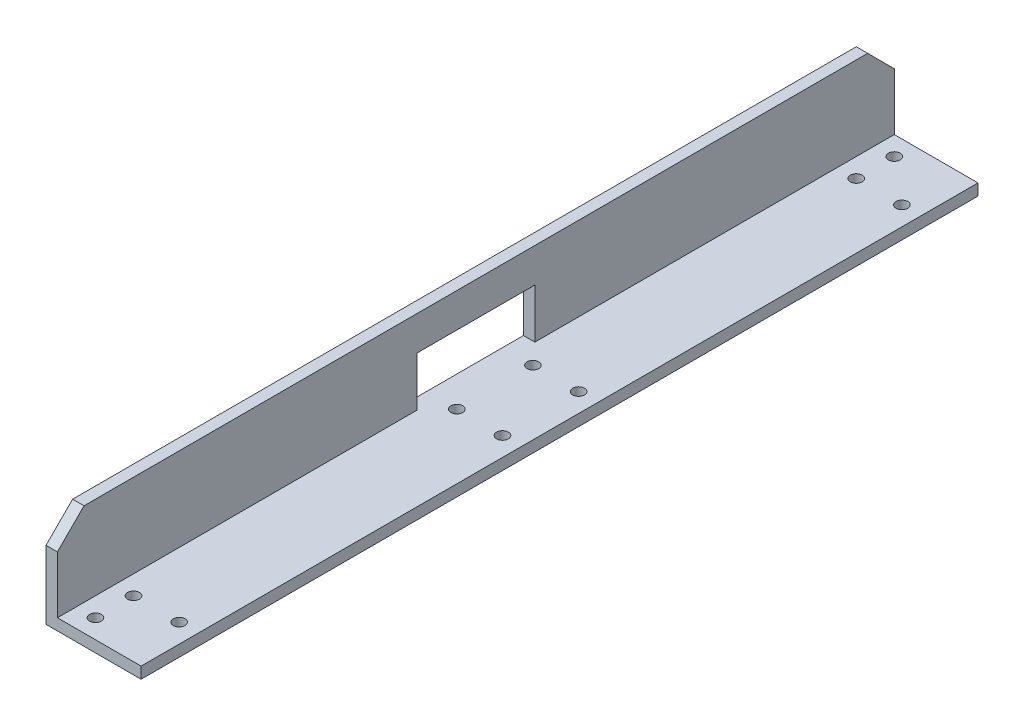
ISO-10303-21;
HEADER;
FILE_DESCRIPTION(('STEP AP214'),'2;1');
FILE_NAME('part.step','',(''),(''),'','','');
FILE_SCHEMA(('AUTOMOTIVE_DESIGN { 1 0 10303 214 1 1 1 1 }'));
ENDSEC;
DATA;
#1=APPLICATION_CONTEXT('core data for automotive mechanical design processes');
#2=APPLICATION_PROTOCOL_DEFINITION('international standard','automotive_design',2000,#1);
#3=PRODUCT_CONTEXT('',#1,'mechanical');
#4=PRODUCT('Part','Part','',(#3));
#5=PRODUCT_RELATED_PRODUCT_CATEGORY('part','',(#4));
#6=PRODUCT_DEFINITION_FORMATION('','',#4);
#7=PRODUCT_DEFINITION_CONTEXT('part definition',#1,'design');
#8=PRODUCT_DEFINITION('design','',#6,#7);
#9=PRODUCT_DEFINITION_SHAPE('','',#8);
#10=(LENGTH_UNIT() NAMED_UNIT(*) SI_UNIT(.MILLI.,.METRE.));
#11=(NAMED_UNIT(*) PLANE_ANGLE_UNIT() SI_UNIT($,.RADIAN.));
#12=(NAMED_UNIT(*) SI_UNIT($,.STERADIAN.) SOLID_ANGLE_UNIT());
#13=UNCERTAINTY_MEASURE_WITH_UNIT(LENGTH_MEASURE(1.E-05),#10,'distance_accuracy_value','');
#14=(GEOMETRIC_REPRESENTATION_CONTEXT(3) GLOBAL_UNCERTAINTY_ASSIGNED_CONTEXT((#13)) GLOBAL_UNIT_ASSIGNED_CONTEXT((#10,
#11,#12)) REPRESENTATION_CONTEXT('',''));
#15=CARTESIAN_POINT('',(0.,0.,0.));
#16=DIRECTION('',(0.,0.,1.));
#17=DIRECTION('',(1.,0.,0.));
#18=AXIS2_PLACEMENT_3D('',#15,#16,#17);
#19=CARTESIAN_POINT('',(25.,0.,220.));
#20=DIRECTION('',(0.,1.,0.));
#21=DIRECTION('',(-1.,0.,0.));
#22=AXIS2_PLACEMENT_3D('',#19,#20,#21);
#23=PLANE('',#22);
#24=CARTESIAN_POINT('',(20.,0.,205.));
#25=DIRECTION('',(0.,-1.,0.));
#26=DIRECTION('',(1.,0.,0.));
#27=AXIS2_PLACEMENT_3D('',#24,#25,#26);
#28=CIRCLE('',#27,1.55);
#29=CARTESIAN_POINT('',(21.55,0.,205.));
#30=VERTEX_POINT('',#29);
#31=EDGE_CURVE('E214',#30,#30,#28,.T.);
#32=ORIENTED_EDGE('',*,*,#31,.F.);
#33=EDGE_LOOP('',(#32));
#34=FACE_BOUND('',#33,.T.);
#35=CARTESIAN_POINT('',(20.,0.,100.));
#36=DIRECTION('',(0.,-1.,0.));
#37=DIRECTION('',(1.,0.,0.));
#38=AXIS2_PLACEMENT_3D('',#35,#36,#37);
#39=CIRCLE('',#38,1.55);
#40=CARTESIAN_POINT('',(21.55,0.,100.));
#41=VERTEX_POINT('',#40);
#42=EDGE_CURVE('E210',#41,#41,#39,.T.);
#43=ORIENTED_EDGE('',*,*,#42,.F.);
#44=EDGE_LOOP('',(#43));
#45=FACE_BOUND('',#44,.T.);
#46=CARTESIAN_POINT('',(20.,0.,120.));
#47=DIRECTION('',(0.,-1.,0.));
#48=DIRECTION('',(1.,0.,0.));
#49=AXIS2_PLACEMENT_3D('',#46,#47,#48);
#50=CIRCLE('',#49,1.55);
#51=CARTESIAN_POINT('',(21.55,0.,120.));
#52=VERTEX_POINT('',#51);
#53=EDGE_CURVE('E206',#52,#52,#50,.T.);
#54=ORIENTED_EDGE('',*,*,#53,.F.);
#55=EDGE_LOOP('',(#54));
#56=FACE_BOUND('',#55,.T.);
#57=CARTESIAN_POINT('',(20.,0.,15.));
#58=DIRECTION('',(0.,-1.,0.));
#59=DIRECTION('',(1.,0.,0.));
#60=AXIS2_PLACEMENT_3D('',#57,#58,#59);
#61=CIRCLE('',#60,1.55);
#62=CARTESIAN_POINT('',(21.55,0.,15.));
#63=VERTEX_POINT('',#62);
#64=EDGE_CURVE('E202',#63,#63,#61,.T.);
#65=ORIENTED_EDGE('',*,*,#64,.F.);
#66=EDGE_LOOP('',(#65));
#67=FACE_BOUND('',#66,.T.);
#68=CARTESIAN_POINT('',(8.00000000000003,0.,5.));
#69=DIRECTION('',(0.,-1.,0.));
#70=DIRECTION('',(1.,0.,0.));
#71=AXIS2_PLACEMENT_3D('',#68,#69,#70);
#72=CIRCLE('',#71,1.55);
#73=CARTESIAN_POINT('',(9.55000000000003,0.,5.));
#74=VERTEX_POINT('',#73);
#75=EDGE_CURVE('E198',#74,#74,#72,.T.);
#76=ORIENTED_EDGE('',*,*,#75,.F.);
#77=EDGE_LOOP('',(#76));
#78=FACE_BOUND('',#77,.T.);
#79=CARTESIAN_POINT('',(8.00000000000002,0.,15.));
#80=DIRECTION('',(0.,-1.,0.));
#81=DIRECTION('',(1.,0.,0.));
#82=AXIS2_PLACEMENT_3D('',#79,#80,#81);
#83=CIRCLE('',#82,1.55);
#84=CARTESIAN_POINT('',(9.55000000000002,0.,15.));
#85=VERTEX_POINT('',#84);
#86=EDGE_CURVE('E194',#85,#85,#83,.T.);
#87=ORIENTED_EDGE('',*,*,#86,.F.);
#88=EDGE_LOOP('',(#87));
#89=FACE_BOUND('',#88,.T.);
#90=CARTESIAN_POINT('',(8.,0.,205.));
#91=DIRECTION('',(0.,-1.,0.));
#92=DIRECTION('',(1.,0.,0.));
#93=AXIS2_PLACEMENT_3D('',#90,#91,#92);
#94=CIRCLE('',#93,1.54999999999999);
#95=CARTESIAN_POINT('',(9.55,0.,205.));
#96=VERTEX_POINT('',#95);
#97=EDGE_CURVE('E190',#96,#96,#94,.T.);
#98=ORIENTED_EDGE('',*,*,#97,.F.);
#99=EDGE_LOOP('',(#98));
#100=FACE_BOUND('',#99,.T.);
#101=CARTESIAN_POINT('',(8.,0.,215.));
#102=DIRECTION('',(0.,-1.,0.));
#103=DIRECTION('',(1.,0.,0.));
#104=AXIS2_PLACEMENT_3D('',#101,#102,#103);
#105=CIRCLE('',#104,1.54999999999993);
#106=CARTESIAN_POINT('',(9.54999999999993,0.,215.));
#107=VERTEX_POINT('',#106);
#108=EDGE_CURVE('E186',#107,#107,#105,.T.);
#109=ORIENTED_EDGE('',*,*,#108,.F.);
#110=EDGE_LOOP('',(#109));
#111=FACE_BOUND('',#110,.T.);
#112=CARTESIAN_POINT('',(8.00000000000001,0.,120.));
#113=DIRECTION('',(0.,-1.,0.));
#114=DIRECTION('',(1.,0.,0.));
#115=AXIS2_PLACEMENT_3D('',#112,#113,#114);
#116=CIRCLE('',#115,1.54999999999999);
#117=CARTESIAN_POINT('',(9.55000000000001,0.,120.));
#118=VERTEX_POINT('',#117);
#119=EDGE_CURVE('E182',#118,#118,#116,.T.);
#120=ORIENTED_EDGE('',*,*,#119,.F.);
#121=EDGE_LOOP('',(#120));
#122=FACE_BOUND('',#121,.T.);
#123=CARTESIAN_POINT('',(8.00000000000004,0.,100.));
#124=DIRECTION('',(0.,-1.,0.));
#125=DIRECTION('',(1.,0.,0.));
#126=AXIS2_PLACEMENT_3D('',#123,#124,#125);
#127=CIRCLE('',#126,1.54999999999999);
#128=CARTESIAN_POINT('',(9.55000000000003,0.,100.));
#129=VERTEX_POINT('',#128);
#130=EDGE_CURVE('E178',#129,#129,#127,.T.);
#131=ORIENTED_EDGE('',*,*,#130,.F.);
#132=EDGE_LOOP('',(#131));
#133=FACE_BOUND('',#132,.T.);
#134=DIRECTION('',(1.,0.,0.));
#135=VECTOR('',#134,1.);
#136=CARTESIAN_POINT('',(25.,0.,0.));
#137=LINE('',#136,#135);
#138=CARTESIAN_POINT('',(0.,0.,0.));
#139=VERTEX_POINT('',#138);
#140=CARTESIAN_POINT('',(25.,0.,0.));
#141=VERTEX_POINT('',#140);
#142=EDGE_CURVE('E242',#139,#141,#137,.T.);
#143=ORIENTED_EDGE('',*,*,#142,.T.);
#144=DIRECTION('',(0.,0.,-1.));
#145=VECTOR('',#144,1.);
#146=CARTESIAN_POINT('',(25.,0.,220.));
#147=LINE('',#146,#145);
#148=CARTESIAN_POINT('',(25.,0.,220.));
#149=VERTEX_POINT('',#148);
#150=EDGE_CURVE('E162',#149,#141,#147,.T.);
#151=ORIENTED_EDGE('',*,*,#150,.F.);
#152=DIRECTION('',(1.,0.,0.));
#153=VECTOR('',#152,1.);
#154=CARTESIAN_POINT('',(25.,0.,220.));
#155=LINE('',#154,#153);
#156=CARTESIAN_POINT('',(0.,0.,220.));
#157=VERTEX_POINT('',#156);
#158=EDGE_CURVE('E243',#157,#149,#155,.T.);
#159=ORIENTED_EDGE('',*,*,#158,.F.);
#160=DIRECTION('',(0.,0.,-1.));
#161=VECTOR('',#160,1.);
#162=CARTESIAN_POINT('',(0.,0.,220.));
#163=LINE('',#162,#161);
#164=EDGE_CURVE('E251',#157,#139,#163,.T.);
#165=ORIENTED_EDGE('',*,*,#164,.T.);
#166=EDGE_LOOP('',(#143,#151,#159,#165));
#167=FACE_BOUND('',#166,.T.);
#168=ADVANCED_FACE('F32',(#34,#45,#56,#67,#78,#89,#100,#111,#122,#133,#167),#23,.F.);
#169=CARTESIAN_POINT('',(25.,3.,220.));
#170=DIRECTION('',(-1.,0.,0.));
#171=DIRECTION('',(0.,0.,1.));
#172=AXIS2_PLACEMENT_3D('',#169,#170,#171);
#173=PLANE('',#172);
#174=DIRECTION('',(0.,1.,0.));
#175=VECTOR('',#174,1.);
#176=CARTESIAN_POINT('',(25.,3.,0.));
#177=LINE('',#176,#175);
#178=CARTESIAN_POINT('',(25.,3.,0.));
#179=VERTEX_POINT('',#178);
#180=EDGE_CURVE('E264',#141,#179,#177,.T.);
#181=ORIENTED_EDGE('',*,*,#180,.T.);
#182=DIRECTION('',(0.,0.,-1.));
#183=VECTOR('',#182,1.);
#184=CARTESIAN_POINT('',(25.,3.,220.));
#185=LINE('',#184,#183);
#186=CARTESIAN_POINT('',(25.,3.,220.));
#187=VERTEX_POINT('',#186);
#188=EDGE_CURVE('E155',#187,#179,#185,.T.);
#189=ORIENTED_EDGE('',*,*,#188,.F.);
#190=DIRECTION('',(0.,1.,0.));
#191=VECTOR('',#190,1.);
#192=CARTESIAN_POINT('',(25.,3.,220.));
#193=LINE('',#192,#191);
#194=EDGE_CURVE('E246',#149,#187,#193,.T.);
#195=ORIENTED_EDGE('',*,*,#194,.F.);
#196=ORIENTED_EDGE('',*,*,#150,.T.);
#197=EDGE_LOOP('',(#181,#189,#195,#196));
#198=FACE_BOUND('',#197,.T.);
#199=ADVANCED_FACE('F268',(#198),#173,.F.);
#200=CARTESIAN_POINT('',(3.,3.,220.));
#201=DIRECTION('',(0.,-1.,0.));
#202=DIRECTION('',(1.,0.,0.));
#203=AXIS2_PLACEMENT_3D('',#200,#201,#202);
#204=PLANE('',#203);
#205=CARTESIAN_POINT('',(20.,3.,205.));
#206=DIRECTION('',(0.,-1.,0.));
#207=DIRECTION('',(1.,0.,0.));
#208=AXIS2_PLACEMENT_3D('',#205,#206,#207);
#209=CIRCLE('',#208,1.55);
#210=CARTESIAN_POINT('',(21.55,3.,205.));
#211=VERTEX_POINT('',#210);
#212=EDGE_CURVE('E211',#211,#211,#209,.T.);
#213=ORIENTED_EDGE('',*,*,#212,.T.);
#214=EDGE_LOOP('',(#213));
#215=FACE_BOUND('',#214,.T.);
#216=CARTESIAN_POINT('',(20.,3.,100.));
#217=DIRECTION('',(0.,-1.,0.));
#218=DIRECTION('',(1.,0.,0.));
#219=AXIS2_PLACEMENT_3D('',#216,#217,#218);
#220=CIRCLE('',#219,1.55);
#221=CARTESIAN_POINT('',(21.55,3.,100.));
#222=VERTEX_POINT('',#221);
#223=EDGE_CURVE('E207',#222,#222,#220,.T.);
#224=ORIENTED_EDGE('',*,*,#223,.T.);
#225=EDGE_LOOP('',(#224));
#226=FACE_BOUND('',#225,.T.);
#227=CARTESIAN_POINT('',(20.,3.,120.));
#228=DIRECTION('',(0.,-1.,0.));
#229=DIRECTION('',(1.,0.,0.));
#230=AXIS2_PLACEMENT_3D('',#227,#228,#229);
#231=CIRCLE('',#230,1.55);
#232=CARTESIAN_POINT('',(21.55,3.,120.));
#233=VERTEX_POINT('',#232);
#234=EDGE_CURVE('E203',#233,#233,#231,.T.);
#235=ORIENTED_EDGE('',*,*,#234,.T.);
#236=EDGE_LOOP('',(#235));
#237=FACE_BOUND('',#236,.T.);
#238=CARTESIAN_POINT('',(20.,3.,15.));
#239=DIRECTION('',(0.,-1.,0.));
#240=DIRECTION('',(1.,0.,0.));
#241=AXIS2_PLACEMENT_3D('',#238,#239,#240);
#242=CIRCLE('',#241,1.55);
#243=CARTESIAN_POINT('',(21.55,3.,15.));
#244=VERTEX_POINT('',#243);
#245=EDGE_CURVE('E199',#244,#244,#242,.T.);
#246=ORIENTED_EDGE('',*,*,#245,.T.);
#247=EDGE_LOOP('',(#246));
#248=FACE_BOUND('',#247,.T.);
#249=CARTESIAN_POINT('',(8.00000000000003,3.,5.));
#250=DIRECTION('',(0.,-1.,0.));
#251=DIRECTION('',(1.,0.,0.));
#252=AXIS2_PLACEMENT_3D('',#249,#250,#251);
#253=CIRCLE('',#252,1.55);
#254=CARTESIAN_POINT('',(9.55000000000003,3.,5.));
#255=VERTEX_POINT('',#254);
#256=EDGE_CURVE('E195',#255,#255,#253,.T.);
#257=ORIENTED_EDGE('',*,*,#256,.T.);
#258=EDGE_LOOP('',(#257));
#259=FACE_BOUND('',#258,.T.);
#260=CARTESIAN_POINT('',(8.00000000000002,3.,15.));
#261=DIRECTION('',(0.,-1.,0.));
#262=DIRECTION('',(1.,0.,0.));
#263=AXIS2_PLACEMENT_3D('',#260,#261,#262);
#264=CIRCLE('',#263,1.55);
#265=CARTESIAN_POINT('',(9.55000000000002,3.,15.));
#266=VERTEX_POINT('',#265);
#267=EDGE_CURVE('E191',#266,#266,#264,.T.);
#268=ORIENTED_EDGE('',*,*,#267,.T.);
#269=EDGE_LOOP('',(#268));
#270=FACE_BOUND('',#269,.T.);
#271=CARTESIAN_POINT('',(8.,3.,205.));
#272=DIRECTION('',(0.,-1.,0.));
#273=DIRECTION('',(1.,0.,0.));
#274=AXIS2_PLACEMENT_3D('',#271,#272,#273);
#275=CIRCLE('',#274,1.54999999999999);
#276=CARTESIAN_POINT('',(9.55,3.,205.));
#277=VERTEX_POINT('',#276);
#278=EDGE_CURVE('E187',#277,#277,#275,.T.);
#279=ORIENTED_EDGE('',*,*,#278,.T.);
#280=EDGE_LOOP('',(#279));
#281=FACE_BOUND('',#280,.T.);
#282=CARTESIAN_POINT('',(8.,3.,215.));
#283=DIRECTION('',(0.,-1.,0.));
#284=DIRECTION('',(1.,0.,0.));
#285=AXIS2_PLACEMENT_3D('',#282,#283,#284);
#286=CIRCLE('',#285,1.54999999999993);
#287=CARTESIAN_POINT('',(9.54999999999993,3.,215.));
#288=VERTEX_POINT('',#287);
#289=EDGE_CURVE('E183',#288,#288,#286,.T.);
#290=ORIENTED_EDGE('',*,*,#289,.T.);
#291=EDGE_LOOP('',(#290));
#292=FACE_BOUND('',#291,.T.);
#293=CARTESIAN_POINT('',(8.00000000000001,3.,120.));
#294=DIRECTION('',(0.,-1.,0.));
#295=DIRECTION('',(1.,0.,0.));
#296=AXIS2_PLACEMENT_3D('',#293,#294,#295);
#297=CIRCLE('',#296,1.54999999999999);
#298=CARTESIAN_POINT('',(9.55000000000001,3.,120.));
#299=VERTEX_POINT('',#298);
#300=EDGE_CURVE('E179',#299,#299,#297,.T.);
#301=ORIENTED_EDGE('',*,*,#300,.T.);
#302=EDGE_LOOP('',(#301));
#303=FACE_BOUND('',#302,.T.);
#304=CARTESIAN_POINT('',(8.00000000000004,3.,100.));
#305=DIRECTION('',(0.,-1.,0.));
#306=DIRECTION('',(1.,0.,0.));
#307=AXIS2_PLACEMENT_3D('',#304,#305,#306);
#308=CIRCLE('',#307,1.54999999999999);
#309=CARTESIAN_POINT('',(9.55000000000003,3.,100.));
#310=VERTEX_POINT('',#309);
#311=EDGE_CURVE('E175',#310,#310,#308,.T.);
#312=ORIENTED_EDGE('',*,*,#311,.T.);
#313=EDGE_LOOP('',(#312));
#314=FACE_BOUND('',#313,.T.);
#315=DIRECTION('',(-1.,0.,0.));
#316=VECTOR('',#315,1.);
#317=CARTESIAN_POINT('',(3.,3.,0.));
#318=LINE('',#317,#316);
#319=CARTESIAN_POINT('',(3.,3.,0.));
#320=VERTEX_POINT('',#319);
#321=EDGE_CURVE('E150',#179,#320,#318,.T.);
#322=ORIENTED_EDGE('',*,*,#321,.T.);
#323=DIRECTION('',(0.,0.,-1.));
#324=VECTOR('',#323,1.);
#325=CARTESIAN_POINT('',(3.,3.,220.));
#326=LINE('',#325,#324);
#327=CARTESIAN_POINT('',(3.,3.,94.5));
#328=VERTEX_POINT('',#327);
#329=EDGE_CURVE('E140',#328,#320,#326,.T.);
#330=ORIENTED_EDGE('',*,*,#329,.F.);
#331=DIRECTION('',(1.,0.,0.));
#332=VECTOR('',#331,1.);
#333=CARTESIAN_POINT('',(-7.,3.,94.5));
#334=LINE('',#333,#332);
#335=CARTESIAN_POINT('',(0.,3.,94.5));
#336=VERTEX_POINT('',#335);
#337=EDGE_CURVE('E125',#336,#328,#334,.T.);
#338=ORIENTED_EDGE('',*,*,#337,.F.);
#339=DIRECTION('',(0.,0.,-1.));
#340=VECTOR('',#339,1.);
#341=CARTESIAN_POINT('',(0.,2.99999999999999,220.));
#342=LINE('',#341,#340);
#343=CARTESIAN_POINT('',(0.,3.,125.5));
#344=VERTEX_POINT('',#343);
#345=EDGE_CURVE('E165',#344,#336,#342,.T.);
#346=ORIENTED_EDGE('',*,*,#345,.F.);
#347=DIRECTION('',(1.,0.,0.));
#348=VECTOR('',#347,1.);
#349=CARTESIAN_POINT('',(-7.,2.99999999999999,125.5));
#350=LINE('',#349,#348);
#351=CARTESIAN_POINT('',(3.,3.,125.5));
#352=VERTEX_POINT('',#351);
#353=EDGE_CURVE('E137',#344,#352,#350,.T.);
#354=ORIENTED_EDGE('',*,*,#353,.T.);
#355=CARTESIAN_POINT('',(3.,3.,220.));
#356=VERTEX_POINT('',#355);
#357=EDGE_CURVE('E151',#356,#352,#326,.T.);
#358=ORIENTED_EDGE('',*,*,#357,.F.);
#359=DIRECTION('',(-1.,0.,0.));
#360=VECTOR('',#359,1.);
#361=CARTESIAN_POINT('',(3.,3.,220.));
#362=LINE('',#361,#360);
#363=EDGE_CURVE('E259',#187,#356,#362,.T.);
#364=ORIENTED_EDGE('',*,*,#363,.F.);
#365=ORIENTED_EDGE('',*,*,#188,.T.);
#366=EDGE_LOOP('',(#322,#330,#338,#346,#354,#358,#364,#365));
#367=FACE_BOUND('',#366,.T.);
#368=ADVANCED_FACE('F147',(#215,#226,#237,#248,#259,#270,#281,#292,#303,#314,#367),#204,.F.);
#369=CARTESIAN_POINT('',(3.,25.,220.));
#370=DIRECTION('',(-1.,0.,0.));
#371=DIRECTION('',(0.,-1.,0.));
#372=AXIS2_PLACEMENT_3D('',#369,#370,#371);
#373=PLANE('',#372);
#374=DIRECTION('',(0.,1.,0.));
#375=VECTOR('',#374,1.);
#376=CARTESIAN_POINT('',(3.,25.,0.));
#377=LINE('',#376,#375);
#378=CARTESIAN_POINT('',(3.,18.,0.));
#379=VERTEX_POINT('',#378);
#380=EDGE_CURVE('E225',#320,#379,#377,.T.);
#381=ORIENTED_EDGE('',*,*,#380,.T.);
#382=DIRECTION('',(0.,0.707106781186548,0.707106781186548));
#383=VECTOR('',#382,1.);
#384=CARTESIAN_POINT('',(3.,25.,6.99999999999998));
#385=LINE('',#384,#383);
#386=CARTESIAN_POINT('',(3.,25.,7.00000000000004));
#387=VERTEX_POINT('',#386);
#388=EDGE_CURVE('E40',#379,#387,#385,.T.);
#389=ORIENTED_EDGE('',*,*,#388,.T.);
#390=DIRECTION('',(0.,0.,-1.));
#391=VECTOR('',#390,1.);
#392=CARTESIAN_POINT('',(3.,25.,220.));
#393=LINE('',#392,#391);
#394=CARTESIAN_POINT('',(3.,25.,213.));
#395=VERTEX_POINT('',#394);
#396=EDGE_CURVE('E152',#395,#387,#393,.T.);
#397=ORIENTED_EDGE('',*,*,#396,.F.);
#398=DIRECTION('',(0.,0.707106781186546,-0.707106781186549));
#399=VECTOR('',#398,1.);
#400=CARTESIAN_POINT('',(3.,18.,220.));
#401=LINE('',#400,#399);
#402=CARTESIAN_POINT('',(3.,18.,220.));
#403=VERTEX_POINT('',#402);
#404=EDGE_CURVE('E47',#395,#403,#401,.F.);
#405=ORIENTED_EDGE('',*,*,#404,.T.);
#406=DIRECTION('',(0.,1.,0.));
#407=VECTOR('',#406,1.);
#408=CARTESIAN_POINT('',(3.,25.,220.));
#409=LINE('',#408,#407);
#410=EDGE_CURVE('E255',#356,#403,#409,.T.);
#411=ORIENTED_EDGE('',*,*,#410,.F.);
#412=ORIENTED_EDGE('',*,*,#357,.T.);
#413=DIRECTION('',(0.,-1.,0.));
#414=VECTOR('',#413,1.);
#415=CARTESIAN_POINT('',(3.,3.,125.5));
#416=LINE('',#415,#414);
#417=CARTESIAN_POINT('',(3.,16.,125.5));
#418=VERTEX_POINT('',#417);
#419=EDGE_CURVE('E145',#418,#352,#416,.T.);
#420=ORIENTED_EDGE('',*,*,#419,.F.);
#421=DIRECTION('',(0.,0.,1.));
#422=VECTOR('',#421,1.);
#423=CARTESIAN_POINT('',(3.,16.,125.5));
#424=LINE('',#423,#422);
#425=CARTESIAN_POINT('',(3.,16.,94.5));
#426=VERTEX_POINT('',#425);
#427=EDGE_CURVE('E144',#426,#418,#424,.T.);
#428=ORIENTED_EDGE('',*,*,#427,.F.);
#429=DIRECTION('',(0.,1.,0.));
#430=VECTOR('',#429,1.);
#431=CARTESIAN_POINT('',(3.,3.,94.5));
#432=LINE('',#431,#430);
#433=EDGE_CURVE('E129',#328,#426,#432,.T.);
#434=ORIENTED_EDGE('',*,*,#433,.F.);
#435=ORIENTED_EDGE('',*,*,#329,.T.);
#436=EDGE_LOOP('',(#381,#389,#397,#405,#411,#412,#420,#428,#434,#435));
#437=FACE_BOUND('',#436,.T.);
#438=ADVANCED_FACE('F139',(#437),#373,.F.);
#439=CARTESIAN_POINT('',(0.,25.,220.));
#440=DIRECTION('',(0.,-1.,0.));
#441=DIRECTION('',(0.,0.,-1.));
#442=AXIS2_PLACEMENT_3D('',#439,#440,#441);
#443=PLANE('',#442);
#444=ORIENTED_EDGE('',*,*,#396,.T.);
#445=DIRECTION('',(-1.,0.,0.));
#446=VECTOR('',#445,1.);
#447=CARTESIAN_POINT('',(0.,25.,6.99999999999998));
#448=LINE('',#447,#446);
#449=CARTESIAN_POINT('',(0.,25.,7.00000000000004));
#450=VERTEX_POINT('',#449);
#451=EDGE_CURVE('E216',#387,#450,#448,.T.);
#452=ORIENTED_EDGE('',*,*,#451,.T.);
#453=DIRECTION('',(0.,0.,-1.));
#454=VECTOR('',#453,1.);
#455=CARTESIAN_POINT('',(0.,25.,220.));
#456=LINE('',#455,#454);
#457=CARTESIAN_POINT('',(0.,25.,213.));
#458=VERTEX_POINT('',#457);
#459=EDGE_CURVE('E157',#458,#450,#456,.T.);
#460=ORIENTED_EDGE('',*,*,#459,.F.);
#461=DIRECTION('',(1.,0.,0.));
#462=VECTOR('',#461,1.);
#463=CARTESIAN_POINT('',(0.,25.,213.));
#464=LINE('',#463,#462);
#465=EDGE_CURVE('E174',#458,#395,#464,.T.);
#466=ORIENTED_EDGE('',*,*,#465,.T.);
#467=EDGE_LOOP('',(#444,#452,#460,#466));
#468=FACE_BOUND('',#467,.T.);
#469=ADVANCED_FACE('F229',(#468),#443,.F.);
#470=CARTESIAN_POINT('',(0.,0.,220.));
#471=DIRECTION('',(1.,0.,0.));
#472=DIRECTION('',(0.,0.,-1.));
#473=AXIS2_PLACEMENT_3D('',#470,#471,#472);
#474=PLANE('',#473);
#475=DIRECTION('',(0.,0.,1.));
#476=VECTOR('',#475,1.);
#477=CARTESIAN_POINT('',(0.,16.,220.));
#478=LINE('',#477,#476);
#479=CARTESIAN_POINT('',(0.,16.,94.5));
#480=VERTEX_POINT('',#479);
#481=CARTESIAN_POINT('',(0.,16.,125.5));
#482=VERTEX_POINT('',#481);
#483=EDGE_CURVE('E168',#480,#482,#478,.T.);
#484=ORIENTED_EDGE('',*,*,#483,.T.);
#485=DIRECTION('',(0.,-1.,0.));
#486=VECTOR('',#485,1.);
#487=CARTESIAN_POINT('',(0.,0.,125.5));
#488=LINE('',#487,#486);
#489=EDGE_CURVE('E171',#482,#344,#488,.T.);
#490=ORIENTED_EDGE('',*,*,#489,.T.);
#491=ORIENTED_EDGE('',*,*,#345,.T.);
#492=DIRECTION('',(0.,1.,0.));
#493=VECTOR('',#492,1.);
#494=CARTESIAN_POINT('',(0.,0.,94.5));
#495=LINE('',#494,#493);
#496=EDGE_CURVE('E132',#336,#480,#495,.T.);
#497=ORIENTED_EDGE('',*,*,#496,.T.);
#498=EDGE_LOOP('',(#484,#490,#491,#497));
#499=FACE_BOUND('',#498,.T.);
#500=ORIENTED_EDGE('',*,*,#459,.T.);
#501=DIRECTION('',(0.,-0.707106781186548,-0.707106781186548));
#502=VECTOR('',#501,1.);
#503=CARTESIAN_POINT('',(0.,25.,6.99999999999998));
#504=LINE('',#503,#502);
#505=CARTESIAN_POINT('',(0.,18.,0.));
#506=VERTEX_POINT('',#505);
#507=EDGE_CURVE('E221',#450,#506,#504,.T.);
#508=ORIENTED_EDGE('',*,*,#507,.T.);
#509=DIRECTION('',(0.,-1.,0.));
#510=VECTOR('',#509,1.);
#511=CARTESIAN_POINT('',(0.,0.,0.));
#512=LINE('',#511,#510);
#513=EDGE_CURVE('E237',#506,#139,#512,.T.);
#514=ORIENTED_EDGE('',*,*,#513,.T.);
#515=ORIENTED_EDGE('',*,*,#164,.F.);
#516=DIRECTION('',(0.,-1.,0.));
#517=VECTOR('',#516,1.);
#518=CARTESIAN_POINT('',(0.,0.,220.));
#519=LINE('',#518,#517);
#520=CARTESIAN_POINT('',(0.,18.,220.));
#521=VERTEX_POINT('',#520);
#522=EDGE_CURVE('E252',#521,#157,#519,.T.);
#523=ORIENTED_EDGE('',*,*,#522,.F.);
#524=DIRECTION('',(0.,-0.707106781186546,0.707106781186549));
#525=VECTOR('',#524,1.);
#526=CARTESIAN_POINT('',(0.,18.,220.));
#527=LINE('',#526,#525);
#528=EDGE_CURVE('E219',#521,#458,#527,.F.);
#529=ORIENTED_EDGE('',*,*,#528,.T.);
#530=EDGE_LOOP('',(#500,#508,#514,#515,#523,#529));
#531=FACE_BOUND('',#530,.T.);
#532=ADVANCED_FACE('F235',(#499,#531),#474,.F.);
#533=CARTESIAN_POINT('',(0.,0.,220.));
#534=DIRECTION('',(0.,0.,-1.));
#535=DIRECTION('',(-1.,0.,0.));
#536=AXIS2_PLACEMENT_3D('',#533,#534,#535);
#537=PLANE('',#536);
#538=ORIENTED_EDGE('',*,*,#410,.T.);
#539=DIRECTION('',(-1.,0.,0.));
#540=VECTOR('',#539,1.);
#541=CARTESIAN_POINT('',(0.,18.,220.));
#542=LINE('',#541,#540);
#543=EDGE_CURVE('E11',#403,#521,#542,.T.);
#544=ORIENTED_EDGE('',*,*,#543,.T.);
#545=ORIENTED_EDGE('',*,*,#522,.T.);
#546=ORIENTED_EDGE('',*,*,#158,.T.);
#547=ORIENTED_EDGE('',*,*,#194,.T.);
#548=ORIENTED_EDGE('',*,*,#363,.T.);
#549=EDGE_LOOP('',(#538,#544,#545,#546,#547,#548));
#550=FACE_BOUND('',#549,.T.);
#551=ADVANCED_FACE('F324',(#550),#537,.F.);
#552=CARTESIAN_POINT('',(0.,0.,0.));
#553=DIRECTION('',(0.,0.,-1.));
#554=DIRECTION('',(-1.,0.,0.));
#555=AXIS2_PLACEMENT_3D('',#552,#553,#554);
#556=PLANE('',#555);
#557=ORIENTED_EDGE('',*,*,#513,.F.);
#558=DIRECTION('',(1.,0.,0.));
#559=VECTOR('',#558,1.);
#560=CARTESIAN_POINT('',(3.,18.,0.));
#561=LINE('',#560,#559);
#562=EDGE_CURVE('E55',#506,#379,#561,.T.);
#563=ORIENTED_EDGE('',*,*,#562,.T.);
#564=ORIENTED_EDGE('',*,*,#380,.F.);
#565=ORIENTED_EDGE('',*,*,#321,.F.);
#566=ORIENTED_EDGE('',*,*,#180,.F.);
#567=ORIENTED_EDGE('',*,*,#142,.F.);
#568=EDGE_LOOP('',(#557,#563,#564,#565,#566,#567));
#569=FACE_BOUND('',#568,.T.);
#570=ADVANCED_FACE('F240',(#569),#556,.T.);
#571=CARTESIAN_POINT('',(-7.,2.99999999999999,125.5));
#572=DIRECTION('',(0.,0.,1.));
#573=DIRECTION('',(1.,0.,0.));
#574=AXIS2_PLACEMENT_3D('',#571,#572,#573);
#575=PLANE('',#574);
#576=DIRECTION('',(1.,0.,0.));
#577=VECTOR('',#576,1.);
#578=CARTESIAN_POINT('',(-7.,16.,125.5));
#579=LINE('',#578,#577);
#580=EDGE_CURVE('E265',#482,#418,#579,.T.);
#581=ORIENTED_EDGE('',*,*,#580,.T.);
#582=ORIENTED_EDGE('',*,*,#419,.T.);
#583=ORIENTED_EDGE('',*,*,#353,.F.);
#584=ORIENTED_EDGE('',*,*,#489,.F.);
#585=EDGE_LOOP('',(#581,#582,#583,#584));
#586=FACE_BOUND('',#585,.T.);
#587=ADVANCED_FACE('F332',(#586),#575,.F.);
#588=CARTESIAN_POINT('',(-7.,16.,125.5));
#589=DIRECTION('',(0.,1.,0.));
#590=DIRECTION('',(-1.,0.,0.));
#591=AXIS2_PLACEMENT_3D('',#588,#589,#590);
#592=PLANE('',#591);
#593=DIRECTION('',(1.,0.,0.));
#594=VECTOR('',#593,1.);
#595=CARTESIAN_POINT('',(-7.,16.,94.5));
#596=LINE('',#595,#594);
#597=EDGE_CURVE('E136',#480,#426,#596,.T.);
#598=ORIENTED_EDGE('',*,*,#597,.T.);
#599=ORIENTED_EDGE('',*,*,#427,.T.);
#600=ORIENTED_EDGE('',*,*,#580,.F.);
#601=ORIENTED_EDGE('',*,*,#483,.F.);
#602=EDGE_LOOP('',(#598,#599,#600,#601));
#603=FACE_BOUND('',#602,.T.);
#604=ADVANCED_FACE('F393',(#603),#592,.F.);
#605=CARTESIAN_POINT('',(-7.,3.,94.5));
#606=DIRECTION('',(0.,0.,-1.));
#607=DIRECTION('',(-1.,0.,0.));
#608=AXIS2_PLACEMENT_3D('',#605,#606,#607);
#609=PLANE('',#608);
#610=ORIENTED_EDGE('',*,*,#337,.T.);
#611=ORIENTED_EDGE('',*,*,#433,.T.);
#612=ORIENTED_EDGE('',*,*,#597,.F.);
#613=ORIENTED_EDGE('',*,*,#496,.F.);
#614=EDGE_LOOP('',(#610,#611,#612,#613));
#615=FACE_BOUND('',#614,.T.);
#616=ADVANCED_FACE('F127',(#615),#609,.F.);
#617=CARTESIAN_POINT('',(8.00000000000004,220.,100.));
#618=DIRECTION('',(0.,-1.,0.));
#619=DIRECTION('',(1.,0.,0.));
#620=AXIS2_PLACEMENT_3D('',#617,#618,#619);
#621=CYLINDRICAL_SURFACE('',#620,1.54999999999999);
#622=ORIENTED_EDGE('',*,*,#130,.T.);
#623=EDGE_LOOP('',(#622));
#624=FACE_BOUND('',#623,.T.);
#625=ORIENTED_EDGE('',*,*,#311,.F.);
#626=EDGE_LOOP('',(#625));
#627=FACE_BOUND('',#626,.T.);
#628=ADVANCED_FACE('F388',(#624,#627),#621,.F.);
#629=CARTESIAN_POINT('',(8.00000000000002,220.,120.));
#630=DIRECTION('',(0.,-1.,0.));
#631=DIRECTION('',(1.,0.,0.));
#632=AXIS2_PLACEMENT_3D('',#629,#630,#631);
#633=CYLINDRICAL_SURFACE('',#632,1.54999999999999);
#634=ORIENTED_EDGE('',*,*,#119,.T.);
#635=EDGE_LOOP('',(#634));
#636=FACE_BOUND('',#635,.T.);
#637=ORIENTED_EDGE('',*,*,#300,.F.);
#638=EDGE_LOOP('',(#637));
#639=FACE_BOUND('',#638,.T.);
#640=ADVANCED_FACE('F384',(#636,#639),#633,.F.);
#641=CARTESIAN_POINT('',(8.,220.,215.));
#642=DIRECTION('',(0.,-1.,0.));
#643=DIRECTION('',(1.,0.,0.));
#644=AXIS2_PLACEMENT_3D('',#641,#642,#643);
#645=CYLINDRICAL_SURFACE('',#644,1.54999999999993);
#646=ORIENTED_EDGE('',*,*,#108,.T.);
#647=EDGE_LOOP('',(#646));
#648=FACE_BOUND('',#647,.T.);
#649=ORIENTED_EDGE('',*,*,#289,.F.);
#650=EDGE_LOOP('',(#649));
#651=FACE_BOUND('',#650,.T.);
#652=ADVANCED_FACE('F380',(#648,#651),#645,.F.);
#653=CARTESIAN_POINT('',(8.00000000000001,220.,205.));
#654=DIRECTION('',(0.,-1.,0.));
#655=DIRECTION('',(1.,0.,0.));
#656=AXIS2_PLACEMENT_3D('',#653,#654,#655);
#657=CYLINDRICAL_SURFACE('',#656,1.54999999999999);
#658=ORIENTED_EDGE('',*,*,#97,.T.);
#659=EDGE_LOOP('',(#658));
#660=FACE_BOUND('',#659,.T.);
#661=ORIENTED_EDGE('',*,*,#278,.F.);
#662=EDGE_LOOP('',(#661));
#663=FACE_BOUND('',#662,.T.);
#664=ADVANCED_FACE('F376',(#660,#663),#657,.F.);
#665=CARTESIAN_POINT('',(8.00000000000003,220.,15.));
#666=DIRECTION('',(0.,-1.,0.));
#667=DIRECTION('',(1.,0.,0.));
#668=AXIS2_PLACEMENT_3D('',#665,#666,#667);
#669=CYLINDRICAL_SURFACE('',#668,1.55);
#670=ORIENTED_EDGE('',*,*,#86,.T.);
#671=EDGE_LOOP('',(#670));
#672=FACE_BOUND('',#671,.T.);
#673=ORIENTED_EDGE('',*,*,#267,.F.);
#674=EDGE_LOOP('',(#673));
#675=FACE_BOUND('',#674,.T.);
#676=ADVANCED_FACE('F372',(#672,#675),#669,.F.);
#677=CARTESIAN_POINT('',(8.00000000000003,220.,5.));
#678=DIRECTION('',(0.,-1.,0.));
#679=DIRECTION('',(1.,0.,0.));
#680=AXIS2_PLACEMENT_3D('',#677,#678,#679);
#681=CYLINDRICAL_SURFACE('',#680,1.55);
#682=ORIENTED_EDGE('',*,*,#75,.T.);
#683=EDGE_LOOP('',(#682));
#684=FACE_BOUND('',#683,.T.);
#685=ORIENTED_EDGE('',*,*,#256,.F.);
#686=EDGE_LOOP('',(#685));
#687=FACE_BOUND('',#686,.T.);
#688=ADVANCED_FACE('F368',(#684,#687),#681,.F.);
#689=CARTESIAN_POINT('',(20.,220.,15.));
#690=DIRECTION('',(0.,-1.,0.));
#691=DIRECTION('',(1.,0.,0.));
#692=AXIS2_PLACEMENT_3D('',#689,#690,#691);
#693=CYLINDRICAL_SURFACE('',#692,1.55);
#694=ORIENTED_EDGE('',*,*,#64,.T.);
#695=EDGE_LOOP('',(#694));
#696=FACE_BOUND('',#695,.T.);
#697=ORIENTED_EDGE('',*,*,#245,.F.);
#698=EDGE_LOOP('',(#697));
#699=FACE_BOUND('',#698,.T.);
#700=ADVANCED_FACE('F364',(#696,#699),#693,.F.);
#701=CARTESIAN_POINT('',(20.,220.,120.));
#702=DIRECTION('',(0.,-1.,0.));
#703=DIRECTION('',(1.,0.,0.));
#704=AXIS2_PLACEMENT_3D('',#701,#702,#703);
#705=CYLINDRICAL_SURFACE('',#704,1.55);
#706=ORIENTED_EDGE('',*,*,#53,.T.);
#707=EDGE_LOOP('',(#706));
#708=FACE_BOUND('',#707,.T.);
#709=ORIENTED_EDGE('',*,*,#234,.F.);
#710=EDGE_LOOP('',(#709));
#711=FACE_BOUND('',#710,.T.);
#712=ADVANCED_FACE('F358',(#708,#711),#705,.F.);
#713=CARTESIAN_POINT('',(20.,220.,100.));
#714=DIRECTION('',(0.,-1.,0.));
#715=DIRECTION('',(1.,0.,0.));
#716=AXIS2_PLACEMENT_3D('',#713,#714,#715);
#717=CYLINDRICAL_SURFACE('',#716,1.55);
#718=ORIENTED_EDGE('',*,*,#42,.T.);
#719=EDGE_LOOP('',(#718));
#720=FACE_BOUND('',#719,.T.);
#721=ORIENTED_EDGE('',*,*,#223,.F.);
#722=EDGE_LOOP('',(#721));
#723=FACE_BOUND('',#722,.T.);
#724=ADVANCED_FACE('F353',(#720,#723),#717,.F.);
#725=CARTESIAN_POINT('',(20.,220.,205.));
#726=DIRECTION('',(0.,-1.,0.));
#727=DIRECTION('',(1.,0.,0.));
#728=AXIS2_PLACEMENT_3D('',#725,#726,#727);
#729=CYLINDRICAL_SURFACE('',#728,1.55);
#730=ORIENTED_EDGE('',*,*,#31,.T.);
#731=EDGE_LOOP('',(#730));
#732=FACE_BOUND('',#731,.T.);
#733=ORIENTED_EDGE('',*,*,#212,.F.);
#734=EDGE_LOOP('',(#733));
#735=FACE_BOUND('',#734,.T.);
#736=ADVANCED_FACE('F301',(#732,#735),#729,.F.);
#737=CARTESIAN_POINT('',(0.,25.,6.99999999999998));
#738=DIRECTION('',(0.,0.707106781186547,-0.707106781186547));
#739=DIRECTION('',(1.,0.,0.));
#740=AXIS2_PLACEMENT_3D('',#737,#738,#739);
#741=PLANE('',#740);
#742=ORIENTED_EDGE('',*,*,#388,.F.);
#743=ORIENTED_EDGE('',*,*,#562,.F.);
#744=ORIENTED_EDGE('',*,*,#507,.F.);
#745=ORIENTED_EDGE('',*,*,#451,.F.);
#746=EDGE_LOOP('',(#742,#743,#744,#745));
#747=FACE_BOUND('',#746,.T.);
#748=ADVANCED_FACE('F233',(#747),#741,.T.);
#749=CARTESIAN_POINT('',(0.,18.,220.));
#750=DIRECTION('',(0.,-0.707106781186549,-0.707106781186546));
#751=DIRECTION('',(-1.,0.,0.));
#752=AXIS2_PLACEMENT_3D('',#749,#750,#751);
#753=PLANE('',#752);
#754=ORIENTED_EDGE('',*,*,#404,.F.);
#755=ORIENTED_EDGE('',*,*,#465,.F.);
#756=ORIENTED_EDGE('',*,*,#528,.F.);
#757=ORIENTED_EDGE('',*,*,#543,.F.);
#758=EDGE_LOOP('',(#754,#755,#756,#757));
#759=FACE_BOUND('',#758,.T.);
#760=ADVANCED_FACE('F34',(#759),#753,.F.);
#761=CLOSED_SHELL('',(#168,#199,#368,#438,#469,#532,#551,#570,#587,#604,#616,#628,#640,#652,
#664,#676,#688,#700,#712,#724,#736,#748,#760));
#762=MANIFOLD_SOLID_BREP('B2',#761);
#763=ADVANCED_BREP_SHAPE_REPRESENTATION('',(#18,#762),#14);
#764=SHAPE_DEFINITION_REPRESENTATION(#9,#763);
ENDSEC;
END-ISO-10303-21;
